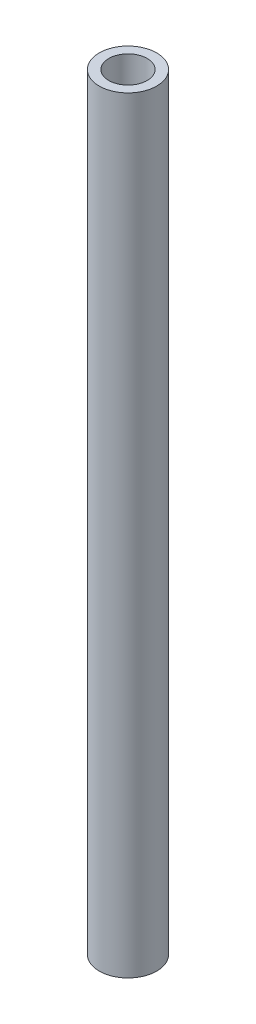
ISO-10303-21;
HEADER;
FILE_DESCRIPTION(('STEP AP214'),'2;1');
FILE_NAME('part.step','',(''),(''),'','','');
FILE_SCHEMA(('AUTOMOTIVE_DESIGN { 1 0 10303 214 1 1 1 1 }'));
ENDSEC;
DATA;
#1=APPLICATION_CONTEXT('core data for automotive mechanical design processes');
#2=APPLICATION_PROTOCOL_DEFINITION('international standard','automotive_design',2000,#1);
#3=PRODUCT_CONTEXT('',#1,'mechanical');
#4=PRODUCT('Part','Part','',(#3));
#5=PRODUCT_RELATED_PRODUCT_CATEGORY('part','',(#4));
#6=PRODUCT_DEFINITION_FORMATION('','',#4);
#7=PRODUCT_DEFINITION_CONTEXT('part definition',#1,'design');
#8=PRODUCT_DEFINITION('design','',#6,#7);
#9=PRODUCT_DEFINITION_SHAPE('','',#8);
#10=(LENGTH_UNIT() NAMED_UNIT(*) SI_UNIT(.MILLI.,.METRE.));
#11=(NAMED_UNIT(*) PLANE_ANGLE_UNIT() SI_UNIT($,.RADIAN.));
#12=(NAMED_UNIT(*) SI_UNIT($,.STERADIAN.) SOLID_ANGLE_UNIT());
#13=UNCERTAINTY_MEASURE_WITH_UNIT(LENGTH_MEASURE(1.E-05),#10,'distance_accuracy_value','');
#14=(GEOMETRIC_REPRESENTATION_CONTEXT(3) GLOBAL_UNCERTAINTY_ASSIGNED_CONTEXT((#13)) GLOBAL_UNIT_ASSIGNED_CONTEXT((#10,
#11,#12)) REPRESENTATION_CONTEXT('',''));
#15=CARTESIAN_POINT('',(0.,0.,0.));
#16=DIRECTION('',(0.,0.,1.));
#17=DIRECTION('',(1.,0.,0.));
#18=AXIS2_PLACEMENT_3D('',#15,#16,#17);
#19=CARTESIAN_POINT('',(0.,127.,0.));
#20=DIRECTION('',(0.,1.,0.));
#21=DIRECTION('',(0.,0.,1.));
#22=AXIS2_PLACEMENT_3D('',#19,#20,#21);
#23=PLANE('',#22);
#24=CARTESIAN_POINT('',(0.,127.,0.));
#25=DIRECTION('',(0.,1.,0.));
#26=DIRECTION('',(0.,0.,1.));
#27=AXIS2_PLACEMENT_3D('',#24,#25,#26);
#28=CIRCLE('',#27,4.7625);
#29=CARTESIAN_POINT('',(0.,127.,4.7625));
#30=VERTEX_POINT('',#29);
#31=EDGE_CURVE('E10',#30,#30,#28,.T.);
#32=ORIENTED_EDGE('',*,*,#31,.T.);
#33=EDGE_LOOP('',(#32));
#34=FACE_BOUND('',#33,.T.);
#35=CARTESIAN_POINT('',(0.,127.,0.));
#36=DIRECTION('',(0.,1.,0.));
#37=DIRECTION('',(0.,0.,1.));
#38=AXIS2_PLACEMENT_3D('',#35,#36,#37);
#39=CIRCLE('',#38,3.175);
#40=CARTESIAN_POINT('',(0.,127.,3.175));
#41=VERTEX_POINT('',#40);
#42=EDGE_CURVE('E45',#41,#41,#39,.T.);
#43=ORIENTED_EDGE('',*,*,#42,.F.);
#44=EDGE_LOOP('',(#43));
#45=FACE_BOUND('',#44,.T.);
#46=ADVANCED_FACE('F34',(#34,#45),#23,.T.);
#47=CARTESIAN_POINT('',(0.,0.,0.));
#48=DIRECTION('',(0.,1.,0.));
#49=DIRECTION('',(0.,0.,1.));
#50=AXIS2_PLACEMENT_3D('',#47,#48,#49);
#51=PLANE('',#50);
#52=CARTESIAN_POINT('',(0.,0.,0.));
#53=DIRECTION('',(0.,1.,0.));
#54=DIRECTION('',(0.,0.,1.));
#55=AXIS2_PLACEMENT_3D('',#52,#53,#54);
#56=CIRCLE('',#55,4.7625);
#57=CARTESIAN_POINT('',(0.,0.,4.7625));
#58=VERTEX_POINT('',#57);
#59=EDGE_CURVE('E38',#58,#58,#56,.T.);
#60=ORIENTED_EDGE('',*,*,#59,.F.);
#61=EDGE_LOOP('',(#60));
#62=FACE_BOUND('',#61,.T.);
#63=CARTESIAN_POINT('',(0.,0.,0.));
#64=DIRECTION('',(0.,1.,0.));
#65=DIRECTION('',(0.,0.,1.));
#66=AXIS2_PLACEMENT_3D('',#63,#64,#65);
#67=CIRCLE('',#66,3.175);
#68=CARTESIAN_POINT('',(0.,0.,3.175));
#69=VERTEX_POINT('',#68);
#70=EDGE_CURVE('E47',#69,#69,#67,.T.);
#71=ORIENTED_EDGE('',*,*,#70,.T.);
#72=EDGE_LOOP('',(#71));
#73=FACE_BOUND('',#72,.T.);
#74=ADVANCED_FACE('F57',(#62,#73),#51,.F.);
#75=CARTESIAN_POINT('',(0.,127.,0.));
#76=DIRECTION('',(0.,-1.,0.));
#77=DIRECTION('',(0.,0.,-1.));
#78=AXIS2_PLACEMENT_3D('',#75,#76,#77);
#79=CYLINDRICAL_SURFACE('',#78,4.7625);
#80=ORIENTED_EDGE('',*,*,#31,.F.);
#81=EDGE_LOOP('',(#80));
#82=FACE_BOUND('',#81,.T.);
#83=ORIENTED_EDGE('',*,*,#59,.T.);
#84=EDGE_LOOP('',(#83));
#85=FACE_BOUND('',#84,.T.);
#86=ADVANCED_FACE('F36',(#82,#85),#79,.T.);
#87=CARTESIAN_POINT('',(0.,127.,0.));
#88=DIRECTION('',(0.,-1.,0.));
#89=DIRECTION('',(0.,0.,-1.));
#90=AXIS2_PLACEMENT_3D('',#87,#88,#89);
#91=CYLINDRICAL_SURFACE('',#90,3.175);
#92=ORIENTED_EDGE('',*,*,#42,.T.);
#93=EDGE_LOOP('',(#92));
#94=FACE_BOUND('',#93,.T.);
#95=ORIENTED_EDGE('',*,*,#70,.F.);
#96=EDGE_LOOP('',(#95));
#97=FACE_BOUND('',#96,.T.);
#98=ADVANCED_FACE('F53',(#94,#97),#91,.F.);
#99=CLOSED_SHELL('',(#46,#74,#86,#98));
#100=MANIFOLD_SOLID_BREP('B2',#99);
#101=ADVANCED_BREP_SHAPE_REPRESENTATION('',(#18,#100),#14);
#102=SHAPE_DEFINITION_REPRESENTATION(#9,#101);
ENDSEC;
END-ISO-10303-21;
